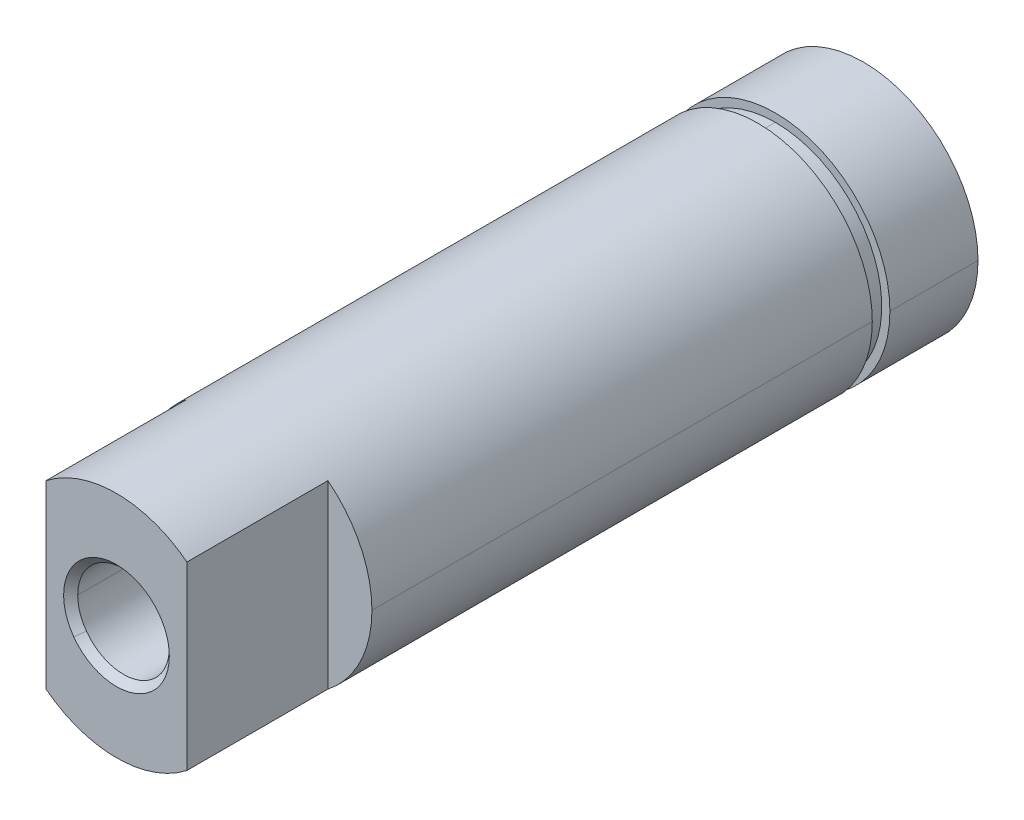
ISO-10303-21;
HEADER;
FILE_DESCRIPTION(('STEP AP214'),'2;1');
FILE_NAME('part.step','',(''),(''),'','','');
FILE_SCHEMA(('AUTOMOTIVE_DESIGN { 1 0 10303 214 1 1 1 1 }'));
ENDSEC;
DATA;
#1=APPLICATION_CONTEXT('core data for automotive mechanical design processes');
#2=APPLICATION_PROTOCOL_DEFINITION('international standard','automotive_design',2000,#1);
#3=PRODUCT_CONTEXT('',#1,'mechanical');
#4=PRODUCT('Part','Part','',(#3));
#5=PRODUCT_RELATED_PRODUCT_CATEGORY('part','',(#4));
#6=PRODUCT_DEFINITION_FORMATION('','',#4);
#7=PRODUCT_DEFINITION_CONTEXT('part definition',#1,'design');
#8=PRODUCT_DEFINITION('design','',#6,#7);
#9=PRODUCT_DEFINITION_SHAPE('','',#8);
#10=(LENGTH_UNIT() NAMED_UNIT(*) SI_UNIT(.MILLI.,.METRE.));
#11=(NAMED_UNIT(*) PLANE_ANGLE_UNIT() SI_UNIT($,.RADIAN.));
#12=(NAMED_UNIT(*) SI_UNIT($,.STERADIAN.) SOLID_ANGLE_UNIT());
#13=UNCERTAINTY_MEASURE_WITH_UNIT(LENGTH_MEASURE(1.E-05),#10,'distance_accuracy_value','');
#14=(GEOMETRIC_REPRESENTATION_CONTEXT(3) GLOBAL_UNCERTAINTY_ASSIGNED_CONTEXT((#13)) GLOBAL_UNIT_ASSIGNED_CONTEXT((#10,
#11,#12)) REPRESENTATION_CONTEXT('',''));
#15=CARTESIAN_POINT('',(0.,0.,0.));
#16=DIRECTION('',(0.,0.,1.));
#17=DIRECTION('',(1.,0.,0.));
#18=AXIS2_PLACEMENT_3D('',#15,#16,#17);
#19=CARTESIAN_POINT('',(0.,0.,0.));
#20=DIRECTION('',(0.,0.,1.));
#21=DIRECTION('',(1.,0.,0.));
#22=AXIS2_PLACEMENT_3D('',#19,#20,#21);
#23=CYLINDRICAL_SURFACE('',#22,3.25);
#24=DIRECTION('',(0.,0.,1.));
#25=VECTOR('',#24,1.);
#26=CARTESIAN_POINT('',(-3.25,0.,1.25));
#27=LINE('',#26,#25);
#28=CARTESIAN_POINT('',(-3.25,0.,0.));
#29=VERTEX_POINT('',#28);
#30=CARTESIAN_POINT('',(-3.25,0.,2.5));
#31=VERTEX_POINT('',#30);
#32=EDGE_CURVE('E205',#29,#31,#27,.T.);
#33=ORIENTED_EDGE('',*,*,#32,.F.);
#34=CARTESIAN_POINT('',(0.,0.,0.));
#35=DIRECTION('',(0.,0.,1.));
#36=DIRECTION('',(-1.,0.,0.));
#37=AXIS2_PLACEMENT_3D('',#34,#35,#36);
#38=CIRCLE('',#37,3.25);
#39=CARTESIAN_POINT('',(3.25,0.,0.));
#40=VERTEX_POINT('',#39);
#41=EDGE_CURVE('E225',#29,#40,#38,.T.);
#42=ORIENTED_EDGE('',*,*,#41,.T.);
#43=DIRECTION('',(0.,0.,1.));
#44=VECTOR('',#43,1.);
#45=CARTESIAN_POINT('',(3.25,0.,1.25));
#46=LINE('',#45,#44);
#47=CARTESIAN_POINT('',(3.25,0.,2.5));
#48=VERTEX_POINT('',#47);
#49=EDGE_CURVE('E198',#40,#48,#46,.T.);
#50=ORIENTED_EDGE('',*,*,#49,.T.);
#51=CARTESIAN_POINT('',(0.,0.,2.5));
#52=DIRECTION('',(0.,0.,1.));
#53=DIRECTION('',(-1.,0.,0.));
#54=AXIS2_PLACEMENT_3D('',#51,#52,#53);
#55=CIRCLE('',#54,3.25);
#56=EDGE_CURVE('E230',#31,#48,#55,.T.);
#57=ORIENTED_EDGE('',*,*,#56,.F.);
#58=EDGE_LOOP('',(#33,#42,#50,#57));
#59=FACE_BOUND('',#58,.T.);
#60=ADVANCED_FACE('F16',(#59),#23,.T.);
#61=CARTESIAN_POINT('',(0.,0.,3.));
#62=DIRECTION('',(0.,0.,-1.));
#63=DIRECTION('',(-1.,0.,0.));
#64=AXIS2_PLACEMENT_3D('',#61,#62,#63);
#65=CYLINDRICAL_SURFACE('',#64,3.018225213);
#66=DIRECTION('',(0.,0.,-1.));
#67=VECTOR('',#66,1.);
#68=CARTESIAN_POINT('',(0.,-3.018225213,2.75));
#69=LINE('',#68,#67);
#70=CARTESIAN_POINT('',(0.,-3.018225213,3.));
#71=VERTEX_POINT('',#70);
#72=CARTESIAN_POINT('',(0.,-3.018225213,2.5));
#73=VERTEX_POINT('',#72);
#74=EDGE_CURVE('E190',#71,#73,#69,.T.);
#75=ORIENTED_EDGE('',*,*,#74,.F.);
#76=CARTESIAN_POINT('',(0.,0.,3.));
#77=DIRECTION('',(0.,0.,1.));
#78=DIRECTION('',(0.,1.,0.));
#79=AXIS2_PLACEMENT_3D('',#76,#77,#78);
#80=CIRCLE('',#79,3.018225213);
#81=CARTESIAN_POINT('',(0.,3.018225213,3.));
#82=VERTEX_POINT('',#81);
#83=EDGE_CURVE('E234',#82,#71,#80,.T.);
#84=ORIENTED_EDGE('',*,*,#83,.F.);
#85=DIRECTION('',(0.,0.,-1.));
#86=VECTOR('',#85,1.);
#87=CARTESIAN_POINT('',(0.,3.018225213,2.75));
#88=LINE('',#87,#86);
#89=CARTESIAN_POINT('',(0.,3.018225213,2.5));
#90=VERTEX_POINT('',#89);
#91=EDGE_CURVE('E179',#82,#90,#88,.T.);
#92=ORIENTED_EDGE('',*,*,#91,.T.);
#93=CARTESIAN_POINT('',(0.,0.,2.5));
#94=DIRECTION('',(0.,0.,1.));
#95=DIRECTION('',(0.,1.,0.));
#96=AXIS2_PLACEMENT_3D('',#93,#94,#95);
#97=CIRCLE('',#96,3.018225213);
#98=EDGE_CURVE('E233',#90,#73,#97,.T.);
#99=ORIENTED_EDGE('',*,*,#98,.T.);
#100=EDGE_LOOP('',(#75,#84,#92,#99));
#101=FACE_BOUND('',#100,.T.);
#102=ADVANCED_FACE('F254',(#101),#65,.T.);
#103=CARTESIAN_POINT('',(0.,0.,21.));
#104=DIRECTION('',(0.,0.,1.));
#105=DIRECTION('',(0.,-1.,0.));
#106=AXIS2_PLACEMENT_3D('',#103,#104,#105);
#107=CONICAL_SURFACE('',#106,1.29999999999998,0.785398163397497);
#108=DIRECTION('',(0.57206140281768,0.415626937777463,0.707106781186545));
#109=VECTOR('',#108,1.);
#110=CARTESIAN_POINT('',(1.13262379212492,0.822899353209455,21.1));
#111=LINE('',#110,#109);
#112=CARTESIAN_POINT('',(1.05172209268742,0.764120827980206,21.));
#113=VERTEX_POINT('',#112);
#114=CARTESIAN_POINT('',(1.21352549156241,0.881677878438703,21.2));
#115=VERTEX_POINT('',#114);
#116=EDGE_CURVE('E153',#113,#115,#111,.T.);
#117=ORIENTED_EDGE('',*,*,#116,.F.);
#118=CARTESIAN_POINT('',(0.,0.,21.0000000000001));
#119=DIRECTION('',(1.12422389233118E-13,0.,1.));
#120=DIRECTION('',(1.,0.,-1.12089824601584E-13));
#121=AXIS2_PLACEMENT_3D('',#118,#119,#120);
#122=CIRCLE('',#121,1.29999999999994);
#123=CARTESIAN_POINT('',(1.3,0.,21.));
#124=VERTEX_POINT('',#123);
#125=EDGE_CURVE('E347',#124,#113,#122,.T.);
#126=ORIENTED_EDGE('',*,*,#125,.F.);
#127=CARTESIAN_POINT('',(0.,0.,21.));
#128=DIRECTION('',(0.,0.,1.));
#129=DIRECTION('',(-0.809016994374949,-0.587785252292471,0.));
#130=AXIS2_PLACEMENT_3D('',#127,#128,#129);
#131=CIRCLE('',#130,1.29999999999998);
#132=CARTESIAN_POINT('',(-1.05172209268741,-0.764120827980221,21.));
#133=VERTEX_POINT('',#132);
#134=EDGE_CURVE('E11',#133,#124,#131,.T.);
#135=ORIENTED_EDGE('',*,*,#134,.F.);
#136=DIRECTION('',(-0.572061402817724,-0.415626937777474,0.707106781186503));
#137=VECTOR('',#136,1.);
#138=CARTESIAN_POINT('',(-1.13262379212491,-0.822899353209475,21.1));
#139=LINE('',#138,#137);
#140=CARTESIAN_POINT('',(-1.21352549156242,-0.881677878438728,21.2));
#141=VERTEX_POINT('',#140);
#142=EDGE_CURVE('E166',#133,#141,#139,.T.);
#143=ORIENTED_EDGE('',*,*,#142,.T.);
#144=CARTESIAN_POINT('',(0.,0.,21.2));
#145=DIRECTION('',(0.,0.,-1.));
#146=DIRECTION('',(1.,0.,0.));
#147=AXIS2_PLACEMENT_3D('',#144,#145,#146);
#148=CIRCLE('',#147,1.5);
#149=CARTESIAN_POINT('',(1.5,0.,21.2));
#150=VERTEX_POINT('',#149);
#151=EDGE_CURVE('E156',#150,#141,#148,.T.);
#152=ORIENTED_EDGE('',*,*,#151,.F.);
#153=CARTESIAN_POINT('',(0.,0.,21.1999999999999));
#154=DIRECTION('',(0.,0.,-1.));
#155=DIRECTION('',(0.809016994374929,0.587785252292498,0.));
#156=AXIS2_PLACEMENT_3D('',#153,#154,#155);
#157=CIRCLE('',#156,1.49999999999992);
#158=EDGE_CURVE('E27',#115,#150,#157,.T.);
#159=ORIENTED_EDGE('',*,*,#158,.F.);
#160=EDGE_LOOP('',(#117,#126,#135,#143,#152,#159));
#161=FACE_BOUND('',#160,.T.);
#162=ADVANCED_FACE('F150',(#161),#107,.F.);
#163=CARTESIAN_POINT('',(0.,0.,6.2));
#164=DIRECTION('',(0.,0.,1.));
#165=DIRECTION('',(1.,0.,0.));
#166=AXIS2_PLACEMENT_3D('',#163,#164,#165);
#167=CYLINDRICAL_SURFACE('',#166,1.3);
#168=DIRECTION('',(0.,0.,1.));
#169=VECTOR('',#168,1.);
#170=CARTESIAN_POINT('',(1.3,0.,13.6));
#171=LINE('',#170,#169);
#172=CARTESIAN_POINT('',(1.3,0.,6.2));
#173=VERTEX_POINT('',#172);
#174=EDGE_CURVE('E350',#173,#124,#171,.T.);
#175=ORIENTED_EDGE('',*,*,#174,.F.);
#176=CARTESIAN_POINT('',(0.,0.,6.2));
#177=DIRECTION('',(0.,0.,1.));
#178=DIRECTION('',(-1.,0.,0.));
#179=AXIS2_PLACEMENT_3D('',#176,#177,#178);
#180=CIRCLE('',#179,1.3);
#181=CARTESIAN_POINT('',(-1.3,0.,6.2));
#182=VERTEX_POINT('',#181);
#183=EDGE_CURVE('E370',#182,#173,#180,.T.);
#184=ORIENTED_EDGE('',*,*,#183,.F.);
#185=DIRECTION('',(0.,0.,1.));
#186=VECTOR('',#185,1.);
#187=CARTESIAN_POINT('',(-1.3,0.,13.6));
#188=LINE('',#187,#186);
#189=CARTESIAN_POINT('',(-1.3,0.,21.));
#190=VERTEX_POINT('',#189);
#191=EDGE_CURVE('E344',#182,#190,#188,.T.);
#192=ORIENTED_EDGE('',*,*,#191,.T.);
#193=CARTESIAN_POINT('',(0.,0.,21.));
#194=DIRECTION('',(0.,0.,1.));
#195=DIRECTION('',(-1.,0.,0.));
#196=AXIS2_PLACEMENT_3D('',#193,#194,#195);
#197=CIRCLE('',#196,1.29999999999994);
#198=EDGE_CURVE('E358',#190,#133,#197,.T.);
#199=ORIENTED_EDGE('',*,*,#198,.T.);
#200=ORIENTED_EDGE('',*,*,#134,.T.);
#201=EDGE_LOOP('',(#175,#184,#192,#199,#200));
#202=FACE_BOUND('',#201,.T.);
#203=ADVANCED_FACE('F264',(#202),#167,.F.);
#204=CARTESIAN_POINT('',(0.,0.,3.));
#205=DIRECTION('',(0.,0.,1.));
#206=DIRECTION('',(1.,0.,0.));
#207=AXIS2_PLACEMENT_3D('',#204,#205,#206);
#208=CYLINDRICAL_SURFACE('',#207,3.25);
#209=DIRECTION('',(0.,0.,1.));
#210=VECTOR('',#209,1.);
#211=CARTESIAN_POINT('',(-3.25,0.,10.1));
#212=LINE('',#211,#210);
#213=CARTESIAN_POINT('',(-3.25,0.,3.));
#214=VERTEX_POINT('',#213);
#215=CARTESIAN_POINT('',(-3.25,0.,17.2));
#216=VERTEX_POINT('',#215);
#217=EDGE_CURVE('E337',#214,#216,#212,.T.);
#218=ORIENTED_EDGE('',*,*,#217,.F.);
#219=CARTESIAN_POINT('',(0.,0.,3.));
#220=DIRECTION('',(0.,0.,1.));
#221=DIRECTION('',(-1.,0.,0.));
#222=AXIS2_PLACEMENT_3D('',#219,#220,#221);
#223=CIRCLE('',#222,3.25);
#224=CARTESIAN_POINT('',(3.25,0.,3.));
#225=VERTEX_POINT('',#224);
#226=EDGE_CURVE('E227',#214,#225,#223,.T.);
#227=ORIENTED_EDGE('',*,*,#226,.T.);
#228=DIRECTION('',(0.,0.,1.));
#229=VECTOR('',#228,1.);
#230=CARTESIAN_POINT('',(3.25,0.,10.1));
#231=LINE('',#230,#229);
#232=CARTESIAN_POINT('',(3.25,0.,17.2));
#233=VERTEX_POINT('',#232);
#234=EDGE_CURVE('E228',#225,#233,#231,.T.);
#235=ORIENTED_EDGE('',*,*,#234,.T.);
#236=CARTESIAN_POINT('',(1.00399983465893E-09,0.,17.2000000000001));
#237=DIRECTION('',(0.,0.,-1.));
#238=DIRECTION('',(1.,0.,0.));
#239=AXIS2_PLACEMENT_3D('',#236,#237,#238);
#240=CIRCLE('',#239,3.24999999899943);
#241=CARTESIAN_POINT('',(2.,-2.561737691,17.2));
#242=VERTEX_POINT('',#241);
#243=EDGE_CURVE('E294',#233,#242,#240,.T.);
#244=ORIENTED_EDGE('',*,*,#243,.T.);
#245=DIRECTION('',(0.,0.,1.));
#246=VECTOR('',#245,1.);
#247=CARTESIAN_POINT('',(2.,-2.561737691,19.2));
#248=LINE('',#247,#246);
#249=CARTESIAN_POINT('',(2.,-2.561737691,21.2));
#250=VERTEX_POINT('',#249);
#251=EDGE_CURVE('E300',#242,#250,#248,.T.);
#252=ORIENTED_EDGE('',*,*,#251,.T.);
#253=CARTESIAN_POINT('',(0.,0.,21.2));
#254=DIRECTION('',(0.,0.,1.));
#255=DIRECTION('',(-0.615384615457734,-0.788226981939807,0.));
#256=AXIS2_PLACEMENT_3D('',#253,#254,#255);
#257=CIRCLE('',#256,3.24999999961384);
#258=CARTESIAN_POINT('',(-2.,-2.561737691,21.2));
#259=VERTEX_POINT('',#258);
#260=EDGE_CURVE('E372',#259,#250,#257,.T.);
#261=ORIENTED_EDGE('',*,*,#260,.F.);
#262=DIRECTION('',(0.,0.,-1.));
#263=VECTOR('',#262,1.);
#264=CARTESIAN_POINT('',(-2.,-2.561737691,19.2));
#265=LINE('',#264,#263);
#266=CARTESIAN_POINT('',(-2.,-2.561737691,17.2));
#267=VERTEX_POINT('',#266);
#268=EDGE_CURVE('E379',#259,#267,#265,.T.);
#269=ORIENTED_EDGE('',*,*,#268,.T.);
#270=CARTESIAN_POINT('',(-1.00400633987197E-09,0.,17.1999999999999));
#271=DIRECTION('',(0.,0.,-1.));
#272=DIRECTION('',(-0.615384615265798,-0.788226982089655,0.));
#273=AXIS2_PLACEMENT_3D('',#270,#271,#272);
#274=CIRCLE('',#273,3.24999999899943);
#275=EDGE_CURVE('E373',#267,#216,#274,.T.);
#276=ORIENTED_EDGE('',*,*,#275,.T.);
#277=EDGE_LOOP('',(#218,#227,#235,#244,#252,#261,#269,#276));
#278=FACE_BOUND('',#277,.T.);
#279=ADVANCED_FACE('F267',(#278),#208,.T.);
#280=CARTESIAN_POINT('',(-2.01,-4.13317780801626,21.2));
#281=DIRECTION('',(0.,0.,1.));
#282=DIRECTION('',(1.,0.,0.));
#283=AXIS2_PLACEMENT_3D('',#280,#281,#282);
#284=PLANE('',#283);
#285=ORIENTED_EDGE('',*,*,#151,.T.);
#286=CARTESIAN_POINT('',(0.,0.,21.2));
#287=DIRECTION('',(0.,0.,-1.));
#288=DIRECTION('',(-0.809016994374946,-0.587785252292475,0.));
#289=AXIS2_PLACEMENT_3D('',#286,#287,#288);
#290=CIRCLE('',#289,1.50000000000001);
#291=EDGE_CURVE('E160',#141,#115,#290,.T.);
#292=ORIENTED_EDGE('',*,*,#291,.T.);
#293=ORIENTED_EDGE('',*,*,#158,.T.);
#294=EDGE_LOOP('',(#285,#292,#293));
#295=FACE_BOUND('',#294,.T.);
#296=DIRECTION('',(0.,-1.,0.));
#297=VECTOR('',#296,1.);
#298=CARTESIAN_POINT('',(2.,0.,21.2));
#299=LINE('',#298,#297);
#300=CARTESIAN_POINT('',(2.,2.561737691,21.2));
#301=VERTEX_POINT('',#300);
#302=EDGE_CURVE('E304',#301,#250,#299,.T.);
#303=ORIENTED_EDGE('',*,*,#302,.F.);
#304=CARTESIAN_POINT('',(0.,0.,21.2));
#305=DIRECTION('',(0.,0.,1.));
#306=DIRECTION('',(0.615384615457734,0.788226981939807,0.));
#307=AXIS2_PLACEMENT_3D('',#304,#305,#306);
#308=CIRCLE('',#307,3.24999999961384);
#309=CARTESIAN_POINT('',(-2.,2.561737691,21.2));
#310=VERTEX_POINT('',#309);
#311=EDGE_CURVE('E326',#301,#310,#308,.T.);
#312=ORIENTED_EDGE('',*,*,#311,.T.);
#313=DIRECTION('',(0.,1.,0.));
#314=VECTOR('',#313,1.);
#315=CARTESIAN_POINT('',(-2.,0.,21.2));
#316=LINE('',#315,#314);
#317=EDGE_CURVE('E388',#259,#310,#316,.T.);
#318=ORIENTED_EDGE('',*,*,#317,.F.);
#319=ORIENTED_EDGE('',*,*,#260,.T.);
#320=EDGE_LOOP('',(#303,#312,#318,#319));
#321=FACE_BOUND('',#320,.T.);
#322=ADVANCED_FACE('F161',(#295,#321),#284,.T.);
#323=CARTESIAN_POINT('',(-1.31,-1.31,6.2));
#324=DIRECTION('',(0.,0.,1.));
#325=DIRECTION('',(1.,0.,0.));
#326=AXIS2_PLACEMENT_3D('',#323,#324,#325);
#327=PLANE('',#326);
#328=CARTESIAN_POINT('',(0.,0.,6.2));
#329=DIRECTION('',(0.,0.,1.));
#330=DIRECTION('',(1.,0.,0.));
#331=AXIS2_PLACEMENT_3D('',#328,#329,#330);
#332=CIRCLE('',#331,1.3);
#333=EDGE_CURVE('E354',#173,#182,#332,.T.);
#334=ORIENTED_EDGE('',*,*,#333,.T.);
#335=ORIENTED_EDGE('',*,*,#183,.T.);
#336=EDGE_LOOP('',(#334,#335));
#337=FACE_BOUND('',#336,.T.);
#338=ADVANCED_FACE('F274',(#337),#327,.T.);
#339=CARTESIAN_POINT('',(-3.26,-2.57173769130438,17.2));
#340=DIRECTION('',(0.,0.,1.));
#341=DIRECTION('',(1.,0.,0.));
#342=AXIS2_PLACEMENT_3D('',#339,#340,#341);
#343=PLANE('',#342);
#344=DIRECTION('',(0.,1.,0.));
#345=VECTOR('',#344,1.);
#346=CARTESIAN_POINT('',(-2.,0.,17.2));
#347=LINE('',#346,#345);
#348=CARTESIAN_POINT('',(-2.,2.561737691,17.2));
#349=VERTEX_POINT('',#348);
#350=EDGE_CURVE('E385',#267,#349,#347,.T.);
#351=ORIENTED_EDGE('',*,*,#350,.T.);
#352=CARTESIAN_POINT('',(-1.00399983465893E-09,0.,17.2000000000001));
#353=DIRECTION('',(0.,0.,-1.));
#354=DIRECTION('',(-1.,0.,0.));
#355=AXIS2_PLACEMENT_3D('',#352,#353,#354);
#356=CIRCLE('',#355,3.24999999899943);
#357=EDGE_CURVE('E333',#216,#349,#356,.T.);
#358=ORIENTED_EDGE('',*,*,#357,.F.);
#359=ORIENTED_EDGE('',*,*,#275,.F.);
#360=EDGE_LOOP('',(#351,#358,#359));
#361=FACE_BOUND('',#360,.T.);
#362=ADVANCED_FACE('F277',(#361),#343,.T.);
#363=CARTESIAN_POINT('',(-2.,-2.571737691,17.19));
#364=DIRECTION('',(-1.,0.,0.));
#365=DIRECTION('',(0.,0.,1.));
#366=AXIS2_PLACEMENT_3D('',#363,#364,#365);
#367=PLANE('',#366);
#368=ORIENTED_EDGE('',*,*,#317,.T.);
#369=DIRECTION('',(0.,0.,1.));
#370=VECTOR('',#369,1.);
#371=CARTESIAN_POINT('',(-2.,2.561737691,19.2));
#372=LINE('',#371,#370);
#373=EDGE_CURVE('E330',#349,#310,#372,.T.);
#374=ORIENTED_EDGE('',*,*,#373,.F.);
#375=ORIENTED_EDGE('',*,*,#350,.F.);
#376=ORIENTED_EDGE('',*,*,#268,.F.);
#377=EDGE_LOOP('',(#368,#374,#375,#376));
#378=FACE_BOUND('',#377,.T.);
#379=ADVANCED_FACE('F281',(#378),#367,.T.);
#380=CARTESIAN_POINT('',(1.99,-2.57173769130437,17.2));
#381=DIRECTION('',(0.,0.,1.));
#382=DIRECTION('',(1.,0.,0.));
#383=AXIS2_PLACEMENT_3D('',#380,#381,#382);
#384=PLANE('',#383);
#385=DIRECTION('',(0.,-1.,0.));
#386=VECTOR('',#385,1.);
#387=CARTESIAN_POINT('',(2.,0.,17.2));
#388=LINE('',#387,#386);
#389=CARTESIAN_POINT('',(2.,2.561737691,17.2));
#390=VERTEX_POINT('',#389);
#391=EDGE_CURVE('E292',#390,#242,#388,.T.);
#392=ORIENTED_EDGE('',*,*,#391,.T.);
#393=ORIENTED_EDGE('',*,*,#243,.F.);
#394=CARTESIAN_POINT('',(1.00399983465893E-09,0.,17.2000000000001));
#395=DIRECTION('',(0.,0.,-1.));
#396=DIRECTION('',(0.615384615265799,0.788226982089655,0.));
#397=AXIS2_PLACEMENT_3D('',#394,#395,#396);
#398=CIRCLE('',#397,3.24999999899943);
#399=EDGE_CURVE('E297',#390,#233,#398,.T.);
#400=ORIENTED_EDGE('',*,*,#399,.F.);
#401=EDGE_LOOP('',(#392,#393,#400));
#402=FACE_BOUND('',#401,.T.);
#403=ADVANCED_FACE('F249',(#402),#384,.T.);
#404=CARTESIAN_POINT('',(2.,-2.571737691,21.21));
#405=DIRECTION('',(1.,0.,0.));
#406=DIRECTION('',(0.,0.,-1.));
#407=AXIS2_PLACEMENT_3D('',#404,#405,#406);
#408=PLANE('',#407);
#409=ORIENTED_EDGE('',*,*,#302,.T.);
#410=ORIENTED_EDGE('',*,*,#251,.F.);
#411=ORIENTED_EDGE('',*,*,#391,.F.);
#412=DIRECTION('',(0.,0.,-1.));
#413=VECTOR('',#412,1.);
#414=CARTESIAN_POINT('',(2.,2.561737691,19.2));
#415=LINE('',#414,#413);
#416=EDGE_CURVE('E323',#301,#390,#415,.T.);
#417=ORIENTED_EDGE('',*,*,#416,.F.);
#418=EDGE_LOOP('',(#409,#410,#411,#417));
#419=FACE_BOUND('',#418,.T.);
#420=ADVANCED_FACE('F239',(#419),#408,.T.);
#421=CARTESIAN_POINT('',(-3.26,-3.26,2.5));
#422=DIRECTION('',(0.,0.,1.));
#423=DIRECTION('',(1.,0.,0.));
#424=AXIS2_PLACEMENT_3D('',#421,#422,#423);
#425=PLANE('',#424);
#426=CARTESIAN_POINT('',(0.,0.,2.5));
#427=DIRECTION('',(0.,0.,1.));
#428=DIRECTION('',(0.,-1.,0.));
#429=AXIS2_PLACEMENT_3D('',#426,#427,#428);
#430=CIRCLE('',#429,3.018225213);
#431=EDGE_CURVE('E186',#73,#90,#430,.T.);
#432=ORIENTED_EDGE('',*,*,#431,.F.);
#433=ORIENTED_EDGE('',*,*,#98,.F.);
#434=EDGE_LOOP('',(#432,#433));
#435=FACE_BOUND('',#434,.T.);
#436=ORIENTED_EDGE('',*,*,#56,.T.);
#437=CARTESIAN_POINT('',(0.,0.,2.5));
#438=DIRECTION('',(0.,0.,1.));
#439=DIRECTION('',(1.,0.,0.));
#440=AXIS2_PLACEMENT_3D('',#437,#438,#439);
#441=CIRCLE('',#440,3.25);
#442=EDGE_CURVE('E202',#48,#31,#441,.T.);
#443=ORIENTED_EDGE('',*,*,#442,.T.);
#444=EDGE_LOOP('',(#436,#443));
#445=FACE_BOUND('',#444,.T.);
#446=ADVANCED_FACE('F236',(#435,#445),#425,.T.);
#447=CARTESIAN_POINT('',(3.26,-3.26,3.));
#448=DIRECTION('',(0.,0.,-1.));
#449=DIRECTION('',(-1.,0.,0.));
#450=AXIS2_PLACEMENT_3D('',#447,#448,#449);
#451=PLANE('',#450);
#452=CARTESIAN_POINT('',(0.,0.,3.));
#453=DIRECTION('',(0.,0.,1.));
#454=DIRECTION('',(0.,-1.,0.));
#455=AXIS2_PLACEMENT_3D('',#452,#453,#454);
#456=CIRCLE('',#455,3.018225213);
#457=EDGE_CURVE('E194',#71,#82,#456,.T.);
#458=ORIENTED_EDGE('',*,*,#457,.T.);
#459=ORIENTED_EDGE('',*,*,#83,.T.);
#460=EDGE_LOOP('',(#458,#459));
#461=FACE_BOUND('',#460,.T.);
#462=ORIENTED_EDGE('',*,*,#226,.F.);
#463=CARTESIAN_POINT('',(0.,0.,3.));
#464=DIRECTION('',(0.,0.,1.));
#465=DIRECTION('',(1.,0.,0.));
#466=AXIS2_PLACEMENT_3D('',#463,#464,#465);
#467=CIRCLE('',#466,3.25);
#468=EDGE_CURVE('E341',#225,#214,#467,.T.);
#469=ORIENTED_EDGE('',*,*,#468,.F.);
#470=EDGE_LOOP('',(#462,#469));
#471=FACE_BOUND('',#470,.T.);
#472=ADVANCED_FACE('F238',(#461,#471),#451,.T.);
#473=CARTESIAN_POINT('',(3.26,-3.26,0.));
#474=DIRECTION('',(0.,0.,-1.));
#475=DIRECTION('',(-1.,0.,0.));
#476=AXIS2_PLACEMENT_3D('',#473,#474,#475);
#477=PLANE('',#476);
#478=ORIENTED_EDGE('',*,*,#41,.F.);
#479=CARTESIAN_POINT('',(0.,0.,0.));
#480=DIRECTION('',(0.,0.,1.));
#481=DIRECTION('',(1.,0.,0.));
#482=AXIS2_PLACEMENT_3D('',#479,#480,#481);
#483=CIRCLE('',#482,3.25);
#484=EDGE_CURVE('E20',#40,#29,#483,.T.);
#485=ORIENTED_EDGE('',*,*,#484,.F.);
#486=EDGE_LOOP('',(#478,#485));
#487=FACE_BOUND('',#486,.T.);
#488=ADVANCED_FACE('F224',(#487),#477,.T.);
#489=CARTESIAN_POINT('',(0.,0.,3.));
#490=DIRECTION('',(0.,0.,1.));
#491=DIRECTION('',(1.,0.,0.));
#492=AXIS2_PLACEMENT_3D('',#489,#490,#491);
#493=CYLINDRICAL_SURFACE('',#492,3.25);
#494=ORIENTED_EDGE('',*,*,#468,.T.);
#495=ORIENTED_EDGE('',*,*,#217,.T.);
#496=ORIENTED_EDGE('',*,*,#357,.T.);
#497=ORIENTED_EDGE('',*,*,#373,.T.);
#498=ORIENTED_EDGE('',*,*,#311,.F.);
#499=ORIENTED_EDGE('',*,*,#416,.T.);
#500=ORIENTED_EDGE('',*,*,#399,.T.);
#501=ORIENTED_EDGE('',*,*,#234,.F.);
#502=EDGE_LOOP('',(#494,#495,#496,#497,#498,#499,#500,#501));
#503=FACE_BOUND('',#502,.T.);
#504=ADVANCED_FACE('F397',(#503),#493,.T.);
#505=CARTESIAN_POINT('',(0.,0.,6.2));
#506=DIRECTION('',(0.,0.,1.));
#507=DIRECTION('',(1.,0.,0.));
#508=AXIS2_PLACEMENT_3D('',#505,#506,#507);
#509=CYLINDRICAL_SURFACE('',#508,1.3);
#510=ORIENTED_EDGE('',*,*,#333,.F.);
#511=ORIENTED_EDGE('',*,*,#174,.T.);
#512=ORIENTED_EDGE('',*,*,#125,.T.);
#513=CARTESIAN_POINT('',(0.,0.,21.));
#514=DIRECTION('',(0.,0.,1.));
#515=DIRECTION('',(0.809016994374961,0.587785252292455,0.));
#516=AXIS2_PLACEMENT_3D('',#513,#514,#515);
#517=CIRCLE('',#516,1.29999999999997);
#518=EDGE_CURVE('E171',#113,#190,#517,.T.);
#519=ORIENTED_EDGE('',*,*,#518,.T.);
#520=ORIENTED_EDGE('',*,*,#191,.F.);
#521=EDGE_LOOP('',(#510,#511,#512,#519,#520));
#522=FACE_BOUND('',#521,.T.);
#523=ADVANCED_FACE('F368',(#522),#509,.F.);
#524=CARTESIAN_POINT('',(0.,0.,21.));
#525=DIRECTION('',(0.,0.,1.));
#526=DIRECTION('',(0.,-1.,0.));
#527=AXIS2_PLACEMENT_3D('',#524,#525,#526);
#528=CONICAL_SURFACE('',#527,1.29999999999998,0.785398163397475);
#529=ORIENTED_EDGE('',*,*,#518,.F.);
#530=ORIENTED_EDGE('',*,*,#116,.T.);
#531=ORIENTED_EDGE('',*,*,#291,.F.);
#532=ORIENTED_EDGE('',*,*,#142,.F.);
#533=ORIENTED_EDGE('',*,*,#198,.F.);
#534=EDGE_LOOP('',(#529,#530,#531,#532,#533));
#535=FACE_BOUND('',#534,.T.);
#536=ADVANCED_FACE('F168',(#535),#528,.F.);
#537=CARTESIAN_POINT('',(0.,0.,3.));
#538=DIRECTION('',(0.,0.,-1.));
#539=DIRECTION('',(0.,1.,0.));
#540=AXIS2_PLACEMENT_3D('',#537,#538,#539);
#541=CYLINDRICAL_SURFACE('',#540,3.018225213);
#542=ORIENTED_EDGE('',*,*,#457,.F.);
#543=ORIENTED_EDGE('',*,*,#74,.T.);
#544=ORIENTED_EDGE('',*,*,#431,.T.);
#545=ORIENTED_EDGE('',*,*,#91,.F.);
#546=EDGE_LOOP('',(#542,#543,#544,#545));
#547=FACE_BOUND('',#546,.T.);
#548=ADVANCED_FACE('F415',(#547),#541,.T.);
#549=CARTESIAN_POINT('',(0.,0.,0.));
#550=DIRECTION('',(0.,0.,1.));
#551=DIRECTION('',(1.,0.,0.));
#552=AXIS2_PLACEMENT_3D('',#549,#550,#551);
#553=CYLINDRICAL_SURFACE('',#552,3.25);
#554=ORIENTED_EDGE('',*,*,#484,.T.);
#555=ORIENTED_EDGE('',*,*,#32,.T.);
#556=ORIENTED_EDGE('',*,*,#442,.F.);
#557=ORIENTED_EDGE('',*,*,#49,.F.);
#558=EDGE_LOOP('',(#554,#555,#556,#557));
#559=FACE_BOUND('',#558,.T.);
#560=ADVANCED_FACE('F18',(#559),#553,.T.);
#561=CLOSED_SHELL('',(#60,#102,#162,#203,#279,#322,#338,#362,#379,#403,#420,#446,#472,#488,#504,
#523,#536,#548,#560));
#562=MANIFOLD_SOLID_BREP('B1',#561);
#563=ADVANCED_BREP_SHAPE_REPRESENTATION('',(#18,#562),#14);
#564=SHAPE_DEFINITION_REPRESENTATION(#9,#563);
ENDSEC;
END-ISO-10303-21;
